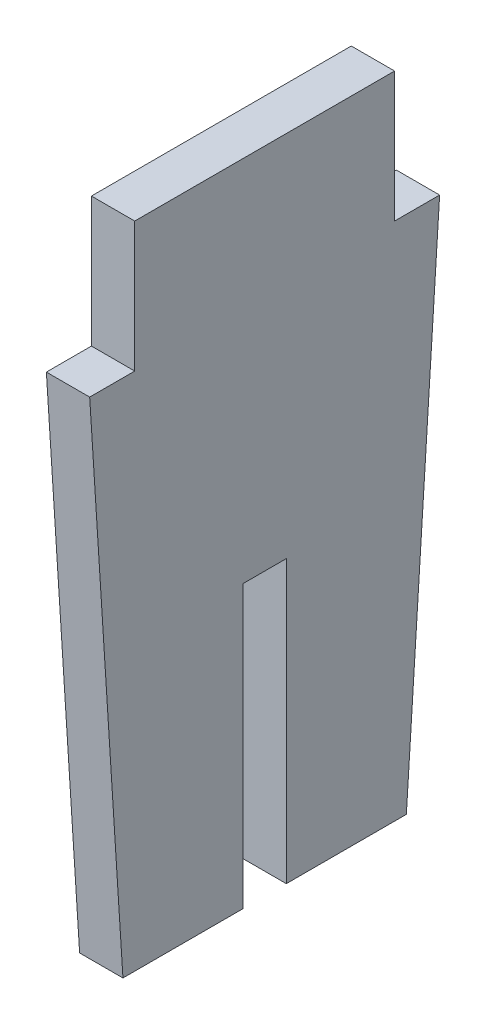
ISO-10303-21;
HEADER;
FILE_DESCRIPTION(('STEP AP214'),'2;1');
FILE_NAME('part.step','',(''),(''),'','','');
FILE_SCHEMA(('AUTOMOTIVE_DESIGN { 1 0 10303 214 1 1 1 1 }'));
ENDSEC;
DATA;
#1=APPLICATION_CONTEXT('core data for automotive mechanical design processes');
#2=APPLICATION_PROTOCOL_DEFINITION('international standard','automotive_design',2000,#1);
#3=PRODUCT_CONTEXT('',#1,'mechanical');
#4=PRODUCT('Part','Part','',(#3));
#5=PRODUCT_RELATED_PRODUCT_CATEGORY('part','',(#4));
#6=PRODUCT_DEFINITION_FORMATION('','',#4);
#7=PRODUCT_DEFINITION_CONTEXT('part definition',#1,'design');
#8=PRODUCT_DEFINITION('design','',#6,#7);
#9=PRODUCT_DEFINITION_SHAPE('','',#8);
#10=(LENGTH_UNIT() NAMED_UNIT(*) SI_UNIT(.MILLI.,.METRE.));
#11=(NAMED_UNIT(*) PLANE_ANGLE_UNIT() SI_UNIT($,.RADIAN.));
#12=(NAMED_UNIT(*) SI_UNIT($,.STERADIAN.) SOLID_ANGLE_UNIT());
#13=UNCERTAINTY_MEASURE_WITH_UNIT(LENGTH_MEASURE(1.E-05),#10,'distance_accuracy_value','');
#14=(GEOMETRIC_REPRESENTATION_CONTEXT(3) GLOBAL_UNCERTAINTY_ASSIGNED_CONTEXT((#13)) GLOBAL_UNIT_ASSIGNED_CONTEXT((#10,
#11,#12)) REPRESENTATION_CONTEXT('',''));
#15=CARTESIAN_POINT('',(0.,0.,0.));
#16=DIRECTION('',(0.,0.,1.));
#17=DIRECTION('',(1.,0.,0.));
#18=AXIS2_PLACEMENT_3D('',#15,#16,#17);
#19=CARTESIAN_POINT('',(3.175,47.625,0.));
#20=DIRECTION('',(0.,0.,-1.));
#21=DIRECTION('',(0.,1.,0.));
#22=AXIS2_PLACEMENT_3D('',#19,#20,#21);
#23=PLANE('',#22);
#24=DIRECTION('',(0.,-1.,0.));
#25=VECTOR('',#24,1.);
#26=CARTESIAN_POINT('',(0.,47.625,0.));
#27=LINE('',#26,#25);
#28=CARTESIAN_POINT('',(0.,47.625,0.));
#29=VERTEX_POINT('',#28);
#30=CARTESIAN_POINT('',(0.,38.1,0.));
#31=VERTEX_POINT('',#30);
#32=EDGE_CURVE('E153',#29,#31,#27,.T.);
#33=ORIENTED_EDGE('',*,*,#32,.T.);
#34=DIRECTION('',(-1.,0.,0.));
#35=VECTOR('',#34,1.);
#36=CARTESIAN_POINT('',(3.175,38.1,0.));
#37=LINE('',#36,#35);
#38=CARTESIAN_POINT('',(3.175,38.1,0.));
#39=VERTEX_POINT('',#38);
#40=EDGE_CURVE('E11',#39,#31,#37,.T.);
#41=ORIENTED_EDGE('',*,*,#40,.F.);
#42=DIRECTION('',(0.,-1.,0.));
#43=VECTOR('',#42,1.);
#44=CARTESIAN_POINT('',(3.175,47.625,0.));
#45=LINE('',#44,#43);
#46=CARTESIAN_POINT('',(3.175,47.625,0.));
#47=VERTEX_POINT('',#46);
#48=EDGE_CURVE('E177',#47,#39,#45,.T.);
#49=ORIENTED_EDGE('',*,*,#48,.F.);
#50=DIRECTION('',(-1.,0.,0.));
#51=VECTOR('',#50,1.);
#52=CARTESIAN_POINT('',(3.175,47.625,0.));
#53=LINE('',#52,#51);
#54=EDGE_CURVE('E149',#47,#29,#53,.T.);
#55=ORIENTED_EDGE('',*,*,#54,.T.);
#56=EDGE_LOOP('',(#33,#41,#49,#55));
#57=FACE_BOUND('',#56,.T.);
#58=ADVANCED_FACE('F33',(#57),#23,.F.);
#59=CARTESIAN_POINT('',(3.175,38.1,0.));
#60=DIRECTION('',(0.,-1.,0.));
#61=DIRECTION('',(0.,0.,-1.));
#62=AXIS2_PLACEMENT_3D('',#59,#60,#61);
#63=PLANE('',#62);
#64=DIRECTION('',(0.,0.,1.));
#65=VECTOR('',#64,1.);
#66=CARTESIAN_POINT('',(0.,38.1,0.));
#67=LINE('',#66,#65);
#68=CARTESIAN_POINT('',(0.,38.1,3.302));
#69=VERTEX_POINT('',#68);
#70=EDGE_CURVE('E156',#31,#69,#67,.T.);
#71=ORIENTED_EDGE('',*,*,#70,.T.);
#72=DIRECTION('',(-1.,0.,0.));
#73=VECTOR('',#72,1.);
#74=CARTESIAN_POINT('',(3.175,38.1,3.302));
#75=LINE('',#74,#73);
#76=CARTESIAN_POINT('',(3.175,38.1,3.302));
#77=VERTEX_POINT('',#76);
#78=EDGE_CURVE('E41',#77,#69,#75,.T.);
#79=ORIENTED_EDGE('',*,*,#78,.F.);
#80=DIRECTION('',(0.,0.,1.));
#81=VECTOR('',#80,1.);
#82=CARTESIAN_POINT('',(3.175,38.1,0.));
#83=LINE('',#82,#81);
#84=EDGE_CURVE('E104',#39,#77,#83,.T.);
#85=ORIENTED_EDGE('',*,*,#84,.F.);
#86=ORIENTED_EDGE('',*,*,#40,.T.);
#87=EDGE_LOOP('',(#71,#79,#85,#86));
#88=FACE_BOUND('',#87,.T.);
#89=ADVANCED_FACE('F204',(#88),#63,.F.);
#90=CARTESIAN_POINT('',(3.175,6.35,1.27000000000001));
#91=DIRECTION('',(0.,0.0638693292837019,-0.997958270057847));
#92=DIRECTION('',(0.,0.997958270057847,0.063869329283702));
#93=AXIS2_PLACEMENT_3D('',#90,#91,#92);
#94=PLANE('',#93);
#95=DIRECTION('',(0.,-0.997958270057847,-0.0638693292837019));
#96=VECTOR('',#95,1.);
#97=CARTESIAN_POINT('',(0.,6.35,1.27000000000001));
#98=LINE('',#97,#96);
#99=CARTESIAN_POINT('',(0.,0.,0.86360000000001));
#100=VERTEX_POINT('',#99);
#101=EDGE_CURVE('E159',#69,#100,#98,.T.);
#102=ORIENTED_EDGE('',*,*,#101,.T.);
#103=DIRECTION('',(-1.,0.,0.));
#104=VECTOR('',#103,1.);
#105=CARTESIAN_POINT('',(3.175,0.,0.86360000000001));
#106=LINE('',#105,#104);
#107=CARTESIAN_POINT('',(3.175,0.,0.86360000000001));
#108=VERTEX_POINT('',#107);
#109=EDGE_CURVE('E196',#108,#100,#106,.T.);
#110=ORIENTED_EDGE('',*,*,#109,.F.);
#111=DIRECTION('',(0.,-0.997958270057847,-0.063869329283702));
#112=VECTOR('',#111,1.);
#113=CARTESIAN_POINT('',(3.175,38.1,3.302));
#114=LINE('',#113,#112);
#115=EDGE_CURVE('E203',#77,#108,#114,.T.);
#116=ORIENTED_EDGE('',*,*,#115,.F.);
#117=ORIENTED_EDGE('',*,*,#78,.T.);
#118=EDGE_LOOP('',(#102,#110,#116,#117));
#119=FACE_BOUND('',#118,.T.);
#120=ADVANCED_FACE('F201',(#119),#94,.F.);
#121=CARTESIAN_POINT('',(3.175,0.,0.86360000000001));
#122=DIRECTION('',(0.,1.,0.));
#123=DIRECTION('',(0.,0.,1.));
#124=AXIS2_PLACEMENT_3D('',#121,#122,#123);
#125=PLANE('',#124);
#126=DIRECTION('',(0.,0.,-1.));
#127=VECTOR('',#126,1.);
#128=CARTESIAN_POINT('',(0.,0.,0.86360000000001));
#129=LINE('',#128,#127);
#130=CARTESIAN_POINT('',(0.,0.,-7.9375));
#131=VERTEX_POINT('',#130);
#132=EDGE_CURVE('E161',#100,#131,#129,.T.);
#133=ORIENTED_EDGE('',*,*,#132,.T.);
#134=DIRECTION('',(-1.,0.,0.));
#135=VECTOR('',#134,1.);
#136=CARTESIAN_POINT('',(3.175,0.,-7.9375));
#137=LINE('',#136,#135);
#138=CARTESIAN_POINT('',(3.175,0.,-7.9375));
#139=VERTEX_POINT('',#138);
#140=EDGE_CURVE('E193',#139,#131,#137,.T.);
#141=ORIENTED_EDGE('',*,*,#140,.F.);
#142=DIRECTION('',(0.,0.,-1.));
#143=VECTOR('',#142,1.);
#144=CARTESIAN_POINT('',(3.175,0.,0.86360000000001));
#145=LINE('',#144,#143);
#146=EDGE_CURVE('E223',#108,#139,#145,.T.);
#147=ORIENTED_EDGE('',*,*,#146,.F.);
#148=ORIENTED_EDGE('',*,*,#109,.T.);
#149=EDGE_LOOP('',(#133,#141,#147,#148));
#150=FACE_BOUND('',#149,.T.);
#151=ADVANCED_FACE('F214',(#150),#125,.F.);
#152=CARTESIAN_POINT('',(3.175,20.6375,-7.9375));
#153=DIRECTION('',(0.,0.,1.));
#154=DIRECTION('',(0.,-1.,0.));
#155=AXIS2_PLACEMENT_3D('',#152,#153,#154);
#156=PLANE('',#155);
#157=DIRECTION('',(0.,1.,0.));
#158=VECTOR('',#157,1.);
#159=CARTESIAN_POINT('',(0.,20.6375,-7.9375));
#160=LINE('',#159,#158);
#161=CARTESIAN_POINT('',(0.,20.6375,-7.9375));
#162=VERTEX_POINT('',#161);
#163=EDGE_CURVE('E163',#131,#162,#160,.T.);
#164=ORIENTED_EDGE('',*,*,#163,.T.);
#165=DIRECTION('',(-1.,0.,0.));
#166=VECTOR('',#165,1.);
#167=CARTESIAN_POINT('',(3.175,20.6375,-7.9375));
#168=LINE('',#167,#166);
#169=CARTESIAN_POINT('',(3.175,20.6375,-7.9375));
#170=VERTEX_POINT('',#169);
#171=EDGE_CURVE('E190',#170,#162,#168,.T.);
#172=ORIENTED_EDGE('',*,*,#171,.F.);
#173=DIRECTION('',(0.,1.,0.));
#174=VECTOR('',#173,1.);
#175=CARTESIAN_POINT('',(3.175,20.6375,-7.9375));
#176=LINE('',#175,#174);
#177=EDGE_CURVE('E220',#139,#170,#176,.T.);
#178=ORIENTED_EDGE('',*,*,#177,.F.);
#179=ORIENTED_EDGE('',*,*,#140,.T.);
#180=EDGE_LOOP('',(#164,#172,#178,#179));
#181=FACE_BOUND('',#180,.T.);
#182=ADVANCED_FACE('F218',(#181),#156,.F.);
#183=CARTESIAN_POINT('',(3.175,20.6375,-11.1125));
#184=DIRECTION('',(0.,1.,0.));
#185=DIRECTION('',(0.,0.,1.));
#186=AXIS2_PLACEMENT_3D('',#183,#184,#185);
#187=PLANE('',#186);
#188=DIRECTION('',(0.,0.,-1.));
#189=VECTOR('',#188,1.);
#190=CARTESIAN_POINT('',(0.,20.6375,-11.1125));
#191=LINE('',#190,#189);
#192=CARTESIAN_POINT('',(0.,20.6375,-11.1125));
#193=VERTEX_POINT('',#192);
#194=EDGE_CURVE('E165',#162,#193,#191,.T.);
#195=ORIENTED_EDGE('',*,*,#194,.T.);
#196=DIRECTION('',(-1.,0.,0.));
#197=VECTOR('',#196,1.);
#198=CARTESIAN_POINT('',(3.175,20.6375,-11.1125));
#199=LINE('',#198,#197);
#200=CARTESIAN_POINT('',(3.175,20.6375,-11.1125));
#201=VERTEX_POINT('',#200);
#202=EDGE_CURVE('E187',#201,#193,#199,.T.);
#203=ORIENTED_EDGE('',*,*,#202,.F.);
#204=DIRECTION('',(0.,0.,-1.));
#205=VECTOR('',#204,1.);
#206=CARTESIAN_POINT('',(3.175,20.6375,-11.1125));
#207=LINE('',#206,#205);
#208=EDGE_CURVE('E222',#170,#201,#207,.T.);
#209=ORIENTED_EDGE('',*,*,#208,.F.);
#210=ORIENTED_EDGE('',*,*,#171,.T.);
#211=EDGE_LOOP('',(#195,#203,#209,#210));
#212=FACE_BOUND('',#211,.T.);
#213=ADVANCED_FACE('F246',(#212),#187,.F.);
#214=CARTESIAN_POINT('',(3.175,20.6375,-11.1125));
#215=DIRECTION('',(0.,0.,-1.));
#216=DIRECTION('',(0.,1.,0.));
#217=AXIS2_PLACEMENT_3D('',#214,#215,#216);
#218=PLANE('',#217);
#219=DIRECTION('',(0.,-1.,0.));
#220=VECTOR('',#219,1.);
#221=CARTESIAN_POINT('',(0.,20.6375,-11.1125));
#222=LINE('',#221,#220);
#223=CARTESIAN_POINT('',(0.,0.,-11.1125));
#224=VERTEX_POINT('',#223);
#225=EDGE_CURVE('E167',#193,#224,#222,.T.);
#226=ORIENTED_EDGE('',*,*,#225,.T.);
#227=DIRECTION('',(-1.,0.,0.));
#228=VECTOR('',#227,1.);
#229=CARTESIAN_POINT('',(3.175,0.,-11.1125));
#230=LINE('',#229,#228);
#231=CARTESIAN_POINT('',(3.175,0.,-11.1125));
#232=VERTEX_POINT('',#231);
#233=EDGE_CURVE('E184',#232,#224,#230,.T.);
#234=ORIENTED_EDGE('',*,*,#233,.F.);
#235=DIRECTION('',(0.,-1.,0.));
#236=VECTOR('',#235,1.);
#237=CARTESIAN_POINT('',(3.175,20.6375,-11.1125));
#238=LINE('',#237,#236);
#239=EDGE_CURVE('E225',#201,#232,#238,.T.);
#240=ORIENTED_EDGE('',*,*,#239,.F.);
#241=ORIENTED_EDGE('',*,*,#202,.T.);
#242=EDGE_LOOP('',(#226,#234,#240,#241));
#243=FACE_BOUND('',#242,.T.);
#244=ADVANCED_FACE('F243',(#243),#218,.F.);
#245=CARTESIAN_POINT('',(3.175,0.,-11.1125));
#246=DIRECTION('',(0.,1.,0.));
#247=DIRECTION('',(0.,0.,1.));
#248=AXIS2_PLACEMENT_3D('',#245,#246,#247);
#249=PLANE('',#248);
#250=DIRECTION('',(0.,0.,-1.));
#251=VECTOR('',#250,1.);
#252=CARTESIAN_POINT('',(0.,0.,-11.1125));
#253=LINE('',#252,#251);
#254=CARTESIAN_POINT('',(0.,0.,-19.9136));
#255=VERTEX_POINT('',#254);
#256=EDGE_CURVE('E169',#224,#255,#253,.T.);
#257=ORIENTED_EDGE('',*,*,#256,.T.);
#258=DIRECTION('',(-1.,0.,0.));
#259=VECTOR('',#258,1.);
#260=CARTESIAN_POINT('',(3.175,0.,-19.9136));
#261=LINE('',#260,#259);
#262=CARTESIAN_POINT('',(3.175,0.,-19.9136));
#263=VERTEX_POINT('',#262);
#264=EDGE_CURVE('E181',#263,#255,#261,.T.);
#265=ORIENTED_EDGE('',*,*,#264,.F.);
#266=DIRECTION('',(0.,0.,-1.));
#267=VECTOR('',#266,1.);
#268=CARTESIAN_POINT('',(3.175,0.,-11.1125));
#269=LINE('',#268,#267);
#270=EDGE_CURVE('E231',#232,#263,#269,.T.);
#271=ORIENTED_EDGE('',*,*,#270,.F.);
#272=ORIENTED_EDGE('',*,*,#233,.T.);
#273=EDGE_LOOP('',(#257,#265,#271,#272));
#274=FACE_BOUND('',#273,.T.);
#275=ADVANCED_FACE('F237',(#274),#249,.F.);
#276=CARTESIAN_POINT('',(3.175,38.1,-22.352));
#277=DIRECTION('',(0.,0.0638693292837024,0.997958270057847));
#278=DIRECTION('',(0.,-0.997958270057847,0.0638693292837024));
#279=AXIS2_PLACEMENT_3D('',#276,#277,#278);
#280=PLANE('',#279);
#281=DIRECTION('',(0.,0.997958270057847,-0.0638693292837024));
#282=VECTOR('',#281,1.);
#283=CARTESIAN_POINT('',(0.,38.1,-22.352));
#284=LINE('',#283,#282);
#285=CARTESIAN_POINT('',(0.,38.1,-22.352));
#286=VERTEX_POINT('',#285);
#287=EDGE_CURVE('E172',#255,#286,#284,.T.);
#288=ORIENTED_EDGE('',*,*,#287,.T.);
#289=DIRECTION('',(-1.,0.,0.));
#290=VECTOR('',#289,1.);
#291=CARTESIAN_POINT('',(3.175,38.1,-22.352));
#292=LINE('',#291,#290);
#293=CARTESIAN_POINT('',(3.175,38.1,-22.352));
#294=VERTEX_POINT('',#293);
#295=EDGE_CURVE('E144',#294,#286,#292,.T.);
#296=ORIENTED_EDGE('',*,*,#295,.F.);
#297=DIRECTION('',(0.,0.997958270057847,-0.0638693292837024));
#298=VECTOR('',#297,1.);
#299=CARTESIAN_POINT('',(3.175,6.35,-20.32));
#300=LINE('',#299,#298);
#301=EDGE_CURVE('E135',#263,#294,#300,.T.);
#302=ORIENTED_EDGE('',*,*,#301,.F.);
#303=ORIENTED_EDGE('',*,*,#264,.T.);
#304=EDGE_LOOP('',(#288,#296,#302,#303));
#305=FACE_BOUND('',#304,.T.);
#306=ADVANCED_FACE('F240',(#305),#280,.F.);
#307=CARTESIAN_POINT('',(3.175,38.1,-19.05));
#308=DIRECTION('',(0.,-1.,0.));
#309=DIRECTION('',(0.,0.,-1.));
#310=AXIS2_PLACEMENT_3D('',#307,#308,#309);
#311=PLANE('',#310);
#312=DIRECTION('',(0.,0.,1.));
#313=VECTOR('',#312,1.);
#314=CARTESIAN_POINT('',(0.,38.1,-19.05));
#315=LINE('',#314,#313);
#316=CARTESIAN_POINT('',(0.,38.1,-19.05));
#317=VERTEX_POINT('',#316);
#318=EDGE_CURVE('E143',#286,#317,#315,.T.);
#319=ORIENTED_EDGE('',*,*,#318,.T.);
#320=DIRECTION('',(-1.,0.,0.));
#321=VECTOR('',#320,1.);
#322=CARTESIAN_POINT('',(3.175,38.1,-19.05));
#323=LINE('',#322,#321);
#324=CARTESIAN_POINT('',(3.175,38.1,-19.05));
#325=VERTEX_POINT('',#324);
#326=EDGE_CURVE('E140',#325,#317,#323,.T.);
#327=ORIENTED_EDGE('',*,*,#326,.F.);
#328=DIRECTION('',(0.,0.,1.));
#329=VECTOR('',#328,1.);
#330=CARTESIAN_POINT('',(3.175,38.1,-19.05));
#331=LINE('',#330,#329);
#332=EDGE_CURVE('E129',#294,#325,#331,.T.);
#333=ORIENTED_EDGE('',*,*,#332,.F.);
#334=ORIENTED_EDGE('',*,*,#295,.T.);
#335=EDGE_LOOP('',(#319,#327,#333,#334));
#336=FACE_BOUND('',#335,.T.);
#337=ADVANCED_FACE('F141',(#336),#311,.F.);
#338=CARTESIAN_POINT('',(3.175,47.625,-19.05));
#339=DIRECTION('',(0.,0.,1.));
#340=DIRECTION('',(0.,-1.,0.));
#341=AXIS2_PLACEMENT_3D('',#338,#339,#340);
#342=PLANE('',#341);
#343=DIRECTION('',(0.,1.,0.));
#344=VECTOR('',#343,1.);
#345=CARTESIAN_POINT('',(0.,47.625,-19.05));
#346=LINE('',#345,#344);
#347=CARTESIAN_POINT('',(0.,47.625,-19.05));
#348=VERTEX_POINT('',#347);
#349=EDGE_CURVE('E90',#317,#348,#346,.T.);
#350=ORIENTED_EDGE('',*,*,#349,.T.);
#351=DIRECTION('',(-1.,0.,0.));
#352=VECTOR('',#351,1.);
#353=CARTESIAN_POINT('',(3.175,47.625,-19.05));
#354=LINE('',#353,#352);
#355=CARTESIAN_POINT('',(3.175,47.625,-19.05));
#356=VERTEX_POINT('',#355);
#357=EDGE_CURVE('E145',#356,#348,#354,.T.);
#358=ORIENTED_EDGE('',*,*,#357,.F.);
#359=DIRECTION('',(0.,1.,0.));
#360=VECTOR('',#359,1.);
#361=CARTESIAN_POINT('',(3.175,47.625,-19.05));
#362=LINE('',#361,#360);
#363=EDGE_CURVE('E133',#325,#356,#362,.T.);
#364=ORIENTED_EDGE('',*,*,#363,.F.);
#365=ORIENTED_EDGE('',*,*,#326,.T.);
#366=EDGE_LOOP('',(#350,#358,#364,#365));
#367=FACE_BOUND('',#366,.T.);
#368=ADVANCED_FACE('F147',(#367),#342,.F.);
#369=CARTESIAN_POINT('',(3.175,47.625,0.));
#370=DIRECTION('',(0.,-1.,0.));
#371=DIRECTION('',(0.,0.,-1.));
#372=AXIS2_PLACEMENT_3D('',#369,#370,#371);
#373=PLANE('',#372);
#374=DIRECTION('',(0.,0.,1.));
#375=VECTOR('',#374,1.);
#376=CARTESIAN_POINT('',(0.,47.625,0.));
#377=LINE('',#376,#375);
#378=EDGE_CURVE('E96',#348,#29,#377,.T.);
#379=ORIENTED_EDGE('',*,*,#378,.T.);
#380=ORIENTED_EDGE('',*,*,#54,.F.);
#381=DIRECTION('',(0.,0.,1.));
#382=VECTOR('',#381,1.);
#383=CARTESIAN_POINT('',(3.175,47.625,0.));
#384=LINE('',#383,#382);
#385=EDGE_CURVE('E49',#356,#47,#384,.T.);
#386=ORIENTED_EDGE('',*,*,#385,.F.);
#387=ORIENTED_EDGE('',*,*,#357,.T.);
#388=EDGE_LOOP('',(#379,#380,#386,#387));
#389=FACE_BOUND('',#388,.T.);
#390=ADVANCED_FACE('F261',(#389),#373,.F.);
#391=CARTESIAN_POINT('',(3.175,0.,0.));
#392=DIRECTION('',(-1.,0.,0.));
#393=DIRECTION('',(0.,0.,1.));
#394=AXIS2_PLACEMENT_3D('',#391,#392,#393);
#395=PLANE('',#394);
#396=ORIENTED_EDGE('',*,*,#48,.T.);
#397=ORIENTED_EDGE('',*,*,#84,.T.);
#398=ORIENTED_EDGE('',*,*,#115,.T.);
#399=ORIENTED_EDGE('',*,*,#146,.T.);
#400=ORIENTED_EDGE('',*,*,#177,.T.);
#401=ORIENTED_EDGE('',*,*,#208,.T.);
#402=ORIENTED_EDGE('',*,*,#239,.T.);
#403=ORIENTED_EDGE('',*,*,#270,.T.);
#404=ORIENTED_EDGE('',*,*,#301,.T.);
#405=ORIENTED_EDGE('',*,*,#332,.T.);
#406=ORIENTED_EDGE('',*,*,#363,.T.);
#407=ORIENTED_EDGE('',*,*,#385,.T.);
#408=EDGE_LOOP('',(#396,#397,#398,#399,#400,#401,#402,#403,#404,#405,#406,#407));
#409=FACE_BOUND('',#408,.T.);
#410=ADVANCED_FACE('F131',(#409),#395,.F.);
#411=CARTESIAN_POINT('',(0.,0.,0.));
#412=DIRECTION('',(-1.,0.,0.));
#413=DIRECTION('',(0.,0.,1.));
#414=AXIS2_PLACEMENT_3D('',#411,#412,#413);
#415=PLANE('',#414);
#416=ORIENTED_EDGE('',*,*,#32,.F.);
#417=ORIENTED_EDGE('',*,*,#378,.F.);
#418=ORIENTED_EDGE('',*,*,#349,.F.);
#419=ORIENTED_EDGE('',*,*,#318,.F.);
#420=ORIENTED_EDGE('',*,*,#287,.F.);
#421=ORIENTED_EDGE('',*,*,#256,.F.);
#422=ORIENTED_EDGE('',*,*,#225,.F.);
#423=ORIENTED_EDGE('',*,*,#194,.F.);
#424=ORIENTED_EDGE('',*,*,#163,.F.);
#425=ORIENTED_EDGE('',*,*,#132,.F.);
#426=ORIENTED_EDGE('',*,*,#101,.F.);
#427=ORIENTED_EDGE('',*,*,#70,.F.);
#428=EDGE_LOOP('',(#416,#417,#418,#419,#420,#421,#422,#423,#424,#425,#426,#427));
#429=FACE_BOUND('',#428,.T.);
#430=ADVANCED_FACE('F208',(#429),#415,.T.);
#431=CLOSED_SHELL('',(#58,#89,#120,#151,#182,#213,#244,#275,#306,#337,#368,#390,#410,#430));
#432=MANIFOLD_SOLID_BREP('B2',#431);
#433=ADVANCED_BREP_SHAPE_REPRESENTATION('',(#18,#432),#14);
#434=SHAPE_DEFINITION_REPRESENTATION(#9,#433);
ENDSEC;
END-ISO-10303-21;
